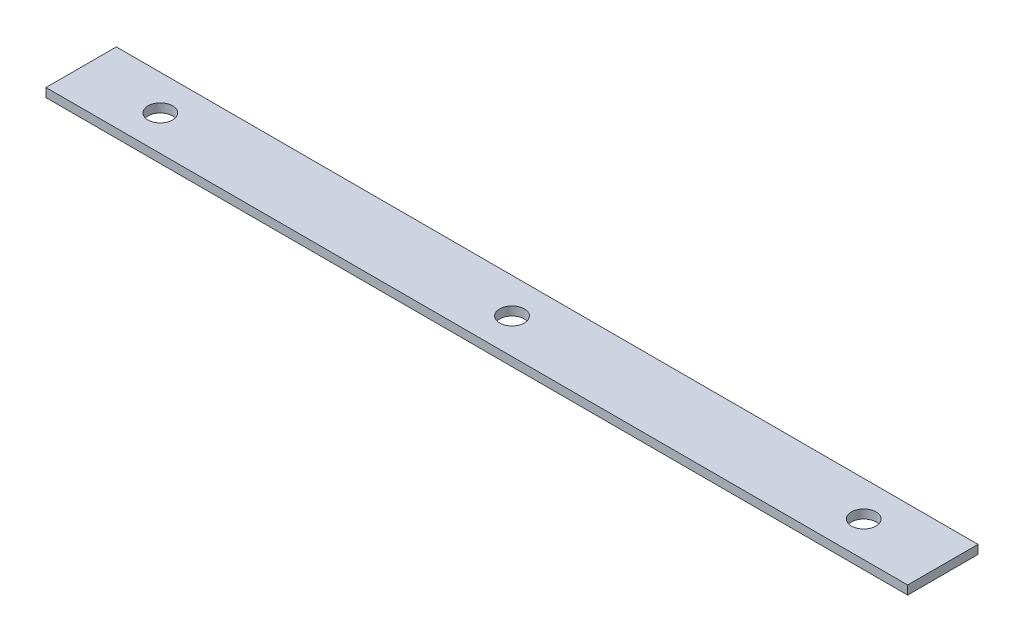
ISO-10303-21;
HEADER;
FILE_DESCRIPTION(('STEP AP214'),'2;1');
FILE_NAME('part.step','',(''),(''),'','','');
FILE_SCHEMA(('AUTOMOTIVE_DESIGN { 1 0 10303 214 1 1 1 1 }'));
ENDSEC;
DATA;
#1=APPLICATION_CONTEXT('core data for automotive mechanical design processes');
#2=APPLICATION_PROTOCOL_DEFINITION('international standard','automotive_design',2000,#1);
#3=PRODUCT_CONTEXT('',#1,'mechanical');
#4=PRODUCT('Part','Part','',(#3));
#5=PRODUCT_RELATED_PRODUCT_CATEGORY('part','',(#4));
#6=PRODUCT_DEFINITION_FORMATION('','',#4);
#7=PRODUCT_DEFINITION_CONTEXT('part definition',#1,'design');
#8=PRODUCT_DEFINITION('design','',#6,#7);
#9=PRODUCT_DEFINITION_SHAPE('','',#8);
#10=(LENGTH_UNIT() NAMED_UNIT(*) SI_UNIT(.MILLI.,.METRE.));
#11=(NAMED_UNIT(*) PLANE_ANGLE_UNIT() SI_UNIT($,.RADIAN.));
#12=(NAMED_UNIT(*) SI_UNIT($,.STERADIAN.) SOLID_ANGLE_UNIT());
#13=UNCERTAINTY_MEASURE_WITH_UNIT(LENGTH_MEASURE(1.E-05),#10,'distance_accuracy_value','');
#14=(GEOMETRIC_REPRESENTATION_CONTEXT(3) GLOBAL_UNCERTAINTY_ASSIGNED_CONTEXT((#13)) GLOBAL_UNIT_ASSIGNED_CONTEXT((#10,
#11,#12)) REPRESENTATION_CONTEXT('',''));
#15=CARTESIAN_POINT('',(0.,0.,0.));
#16=DIRECTION('',(0.,0.,1.));
#17=DIRECTION('',(1.,0.,0.));
#18=AXIS2_PLACEMENT_3D('',#15,#16,#17);
#19=CARTESIAN_POINT('',(122.500000000002,-2.50000000000045,10.0000000000027));
#20=DIRECTION('',(1.00000000000002,0.,0.));
#21=DIRECTION('',(0.,0.,-1.));
#22=AXIS2_PLACEMENT_3D('',#19,#20,#21);
#23=PLANE('',#22);
#24=DIRECTION('',(0.,0.,-1.));
#25=VECTOR('',#24,1.);
#26=CARTESIAN_POINT('',(122.500000000002,-4.44089209850063E-13,10.000000000002));
#27=LINE('',#26,#25);
#28=CARTESIAN_POINT('',(122.500000000002,-4.44089209850063E-13,10.000000000002));
#29=VERTEX_POINT('',#28);
#30=CARTESIAN_POINT('',(122.500000000002,1.11022302462516E-13,-9.99999999999823));
#31=VERTEX_POINT('',#30);
#32=EDGE_CURVE('E103',#29,#31,#27,.T.);
#33=ORIENTED_EDGE('',*,*,#32,.F.);
#34=DIRECTION('',(0.,1.00000000000002,0.));
#35=VECTOR('',#34,1.);
#36=CARTESIAN_POINT('',(122.500000000002,-2.50000000000045,10.0000000000027));
#37=LINE('',#36,#35);
#38=CARTESIAN_POINT('',(122.500000000002,-2.50000000000045,10.0000000000027));
#39=VERTEX_POINT('',#38);
#40=EDGE_CURVE('E11',#39,#29,#37,.T.);
#41=ORIENTED_EDGE('',*,*,#40,.F.);
#42=DIRECTION('',(0.,0.,-1.));
#43=VECTOR('',#42,1.);
#44=CARTESIAN_POINT('',(122.500000000002,-2.50000000000045,10.0000000000027));
#45=LINE('',#44,#43);
#46=CARTESIAN_POINT('',(122.500000000002,-2.49999999999984,-9.99999999999757));
#47=VERTEX_POINT('',#46);
#48=EDGE_CURVE('E96',#39,#47,#45,.T.);
#49=ORIENTED_EDGE('',*,*,#48,.T.);
#50=DIRECTION('',(0.,1.00000000000002,0.));
#51=VECTOR('',#50,1.);
#52=CARTESIAN_POINT('',(122.500000000002,-2.49999999999984,-9.99999999999757));
#53=LINE('',#52,#51);
#54=EDGE_CURVE('E41',#47,#31,#53,.T.);
#55=ORIENTED_EDGE('',*,*,#54,.T.);
#56=EDGE_LOOP('',(#33,#41,#49,#55));
#57=FACE_BOUND('',#56,.T.);
#58=ADVANCED_FACE('F38',(#57),#23,.T.);
#59=CARTESIAN_POINT('',(-122.500000000003,-2.50000000000006,10.0000000000001));
#60=DIRECTION('',(0.,0.,1.));
#61=DIRECTION('',(1.00000000000002,0.,0.));
#62=AXIS2_PLACEMENT_3D('',#59,#60,#61);
#63=PLANE('',#62);
#64=DIRECTION('',(1.00000000000002,0.,0.));
#65=VECTOR('',#64,1.);
#66=CARTESIAN_POINT('',(-122.500000000003,-2.22044604925031E-13,9.99999999999979));
#67=LINE('',#66,#65);
#68=CARTESIAN_POINT('',(-122.500000000003,-2.22044604925031E-13,9.99999999999979));
#69=VERTEX_POINT('',#68);
#70=EDGE_CURVE('E98',#69,#29,#67,.T.);
#71=ORIENTED_EDGE('',*,*,#70,.F.);
#72=DIRECTION('',(0.,1.00000000000002,0.));
#73=VECTOR('',#72,1.);
#74=CARTESIAN_POINT('',(-122.500000000003,-2.50000000000006,10.0000000000001));
#75=LINE('',#74,#73);
#76=CARTESIAN_POINT('',(-122.500000000003,-2.50000000000006,10.0000000000001));
#77=VERTEX_POINT('',#76);
#78=EDGE_CURVE('E47',#77,#69,#75,.T.);
#79=ORIENTED_EDGE('',*,*,#78,.F.);
#80=DIRECTION('',(1.00000000000002,0.,0.));
#81=VECTOR('',#80,1.);
#82=CARTESIAN_POINT('',(-122.500000000003,-2.50000000000006,10.0000000000001));
#83=LINE('',#82,#81);
#84=EDGE_CURVE('E93',#77,#39,#83,.T.);
#85=ORIENTED_EDGE('',*,*,#84,.T.);
#86=ORIENTED_EDGE('',*,*,#40,.T.);
#87=EDGE_LOOP('',(#71,#79,#85,#86));
#88=FACE_BOUND('',#87,.T.);
#89=ADVANCED_FACE('F114',(#88),#63,.T.);
#90=CARTESIAN_POINT('',(-122.500000000003,-2.50000000000006,10.0000000000001));
#91=DIRECTION('',(-1.00000000000002,0.,0.));
#92=DIRECTION('',(0.,0.,1.));
#93=AXIS2_PLACEMENT_3D('',#90,#91,#92);
#94=PLANE('',#93);
#95=DIRECTION('',(0.,0.,1.));
#96=VECTOR('',#95,1.);
#97=CARTESIAN_POINT('',(-122.500000000003,-2.22044604925031E-13,9.99999999999979));
#98=LINE('',#97,#96);
#99=CARTESIAN_POINT('',(-122.500000000003,0.,-10.0000000000005));
#100=VERTEX_POINT('',#99);
#101=EDGE_CURVE('E88',#100,#69,#98,.T.);
#102=ORIENTED_EDGE('',*,*,#101,.F.);
#103=DIRECTION('',(0.,1.00000000000002,0.));
#104=VECTOR('',#103,1.);
#105=CARTESIAN_POINT('',(-122.500000000003,-2.49999999999956,-10.0000000000001));
#106=LINE('',#105,#104);
#107=CARTESIAN_POINT('',(-122.500000000003,-2.49999999999956,-10.0000000000001));
#108=VERTEX_POINT('',#107);
#109=EDGE_CURVE('E83',#108,#100,#106,.T.);
#110=ORIENTED_EDGE('',*,*,#109,.F.);
#111=DIRECTION('',(0.,0.,1.));
#112=VECTOR('',#111,1.);
#113=CARTESIAN_POINT('',(-122.500000000003,-2.50000000000006,10.0000000000001));
#114=LINE('',#113,#112);
#115=EDGE_CURVE('E86',#108,#77,#114,.T.);
#116=ORIENTED_EDGE('',*,*,#115,.T.);
#117=ORIENTED_EDGE('',*,*,#78,.T.);
#118=EDGE_LOOP('',(#102,#110,#116,#117));
#119=FACE_BOUND('',#118,.T.);
#120=ADVANCED_FACE('F85',(#119),#94,.T.);
#121=CARTESIAN_POINT('',(-122.500000000003,-2.49999999999956,-10.0000000000001));
#122=DIRECTION('',(0.,0.,-1.));
#123=DIRECTION('',(-1.00000000000002,0.,0.));
#124=AXIS2_PLACEMENT_3D('',#121,#122,#123);
#125=PLANE('',#124);
#126=DIRECTION('',(-1.00000000000002,0.,0.));
#127=VECTOR('',#126,1.);
#128=CARTESIAN_POINT('',(-122.500000000003,0.,-10.0000000000005));
#129=LINE('',#128,#127);
#130=EDGE_CURVE('E106',#31,#100,#129,.T.);
#131=ORIENTED_EDGE('',*,*,#130,.F.);
#132=ORIENTED_EDGE('',*,*,#54,.F.);
#133=DIRECTION('',(-1.00000000000002,0.,0.));
#134=VECTOR('',#133,1.);
#135=CARTESIAN_POINT('',(-122.500000000003,-2.49999999999956,-10.0000000000001));
#136=LINE('',#135,#134);
#137=EDGE_CURVE('E92',#47,#108,#136,.T.);
#138=ORIENTED_EDGE('',*,*,#137,.T.);
#139=ORIENTED_EDGE('',*,*,#109,.T.);
#140=EDGE_LOOP('',(#131,#132,#138,#139));
#141=FACE_BOUND('',#140,.T.);
#142=ADVANCED_FACE('F95',(#141),#125,.T.);
#143=CARTESIAN_POINT('',(-3.19189119579733E-13,-2.50000000000017,0.));
#144=DIRECTION('',(0.,-1.00000000000002,0.));
#145=DIRECTION('',(0.,0.,-1.));
#146=AXIS2_PLACEMENT_3D('',#143,#144,#145);
#147=PLANE('',#146);
#148=CARTESIAN_POINT('',(-100.000000000002,-2.50000000000006,2.55351295663786E-12));
#149=DIRECTION('',(0.,-1.00000000000002,0.));
#150=DIRECTION('',(0.,0.,-1.));
#151=AXIS2_PLACEMENT_3D('',#148,#149,#150);
#152=CIRCLE('',#151,3.5);
#153=CARTESIAN_POINT('',(-100.000000000002,-2.50000000000006,-3.49999999999745));
#154=VERTEX_POINT('',#153);
#155=EDGE_CURVE('E151',#154,#154,#152,.T.);
#156=ORIENTED_EDGE('',*,*,#155,.F.);
#157=EDGE_LOOP('',(#156));
#158=FACE_BOUND('',#157,.T.);
#159=CARTESIAN_POINT('',(100.000000000001,-2.50000000000017,-4.44089209850063E-13));
#160=DIRECTION('',(0.,-1.00000000000002,0.));
#161=DIRECTION('',(0.,0.,-1.));
#162=AXIS2_PLACEMENT_3D('',#159,#160,#161);
#163=CIRCLE('',#162,3.5);
#164=CARTESIAN_POINT('',(100.000000000001,-2.50000000000017,-3.50000000000045));
#165=VERTEX_POINT('',#164);
#166=EDGE_CURVE('E162',#165,#165,#163,.T.);
#167=ORIENTED_EDGE('',*,*,#166,.F.);
#168=EDGE_LOOP('',(#167));
#169=FACE_BOUND('',#168,.T.);
#170=CARTESIAN_POINT('',(-3.19189119579733E-13,-2.50000000000017,0.));
#171=DIRECTION('',(0.,-1.00000000000002,0.));
#172=DIRECTION('',(0.,0.,-1.));
#173=AXIS2_PLACEMENT_3D('',#170,#171,#172);
#174=CIRCLE('',#173,3.5);
#175=CARTESIAN_POINT('',(-3.19189119579732E-13,-2.50000000000017,-3.5));
#176=VERTEX_POINT('',#175);
#177=EDGE_CURVE('E107',#176,#176,#174,.T.);
#178=ORIENTED_EDGE('',*,*,#177,.F.);
#179=EDGE_LOOP('',(#178));
#180=FACE_BOUND('',#179,.T.);
#181=ORIENTED_EDGE('',*,*,#48,.F.);
#182=ORIENTED_EDGE('',*,*,#84,.F.);
#183=ORIENTED_EDGE('',*,*,#115,.F.);
#184=ORIENTED_EDGE('',*,*,#137,.F.);
#185=EDGE_LOOP('',(#181,#182,#183,#184));
#186=FACE_BOUND('',#185,.T.);
#187=ADVANCED_FACE('F91',(#158,#169,#180,#186),#147,.T.);
#188=CARTESIAN_POINT('',(0.,0.,0.));
#189=DIRECTION('',(0.,-1.00000000000002,0.));
#190=DIRECTION('',(0.,0.,-1.));
#191=AXIS2_PLACEMENT_3D('',#188,#189,#190);
#192=PLANE('',#191);
#193=CARTESIAN_POINT('',(-100.000000000002,4.44089209850063E-13,2.88657986402541E-12));
#194=DIRECTION('',(0.,1.00000000000002,0.));
#195=DIRECTION('',(0.,0.,1.));
#196=AXIS2_PLACEMENT_3D('',#193,#194,#195);
#197=CIRCLE('',#196,3.5);
#198=CARTESIAN_POINT('',(-100.000000000002,4.44089209850063E-13,3.50000000000289));
#199=VERTEX_POINT('',#198);
#200=EDGE_CURVE('E154',#199,#199,#197,.T.);
#201=ORIENTED_EDGE('',*,*,#200,.F.);
#202=EDGE_LOOP('',(#201));
#203=FACE_BOUND('',#202,.T.);
#204=CARTESIAN_POINT('',(100.000000000002,-2.22044604925031E-13,-4.44089209850063E-13));
#205=DIRECTION('',(0.,1.00000000000002,0.));
#206=DIRECTION('',(0.,0.,1.));
#207=AXIS2_PLACEMENT_3D('',#204,#205,#206);
#208=CIRCLE('',#207,3.5);
#209=CARTESIAN_POINT('',(100.000000000002,-2.22044604925031E-13,3.49999999999956));
#210=VERTEX_POINT('',#209);
#211=EDGE_CURVE('E159',#210,#210,#208,.T.);
#212=ORIENTED_EDGE('',*,*,#211,.F.);
#213=EDGE_LOOP('',(#212));
#214=FACE_BOUND('',#213,.T.);
#215=CARTESIAN_POINT('',(0.,0.,0.));
#216=DIRECTION('',(0.,1.00000000000002,0.));
#217=DIRECTION('',(0.,0.,1.));
#218=AXIS2_PLACEMENT_3D('',#215,#216,#217);
#219=CIRCLE('',#218,3.5);
#220=CARTESIAN_POINT('',(0.,0.,3.5));
#221=VERTEX_POINT('',#220);
#222=EDGE_CURVE('E155',#221,#221,#219,.T.);
#223=ORIENTED_EDGE('',*,*,#222,.F.);
#224=EDGE_LOOP('',(#223));
#225=FACE_BOUND('',#224,.T.);
#226=ORIENTED_EDGE('',*,*,#32,.T.);
#227=ORIENTED_EDGE('',*,*,#130,.T.);
#228=ORIENTED_EDGE('',*,*,#101,.T.);
#229=ORIENTED_EDGE('',*,*,#70,.T.);
#230=EDGE_LOOP('',(#226,#227,#228,#229));
#231=FACE_BOUND('',#230,.T.);
#232=ADVANCED_FACE('F113',(#203,#214,#225,#231),#192,.F.);
#233=CARTESIAN_POINT('',(-1.94289029309402E-13,-9.99999999999993,1.11022302462516E-12));
#234=DIRECTION('',(0.,1.00000000000002,0.));
#235=DIRECTION('',(0.,0.,1.));
#236=AXIS2_PLACEMENT_3D('',#233,#234,#235);
#237=CYLINDRICAL_SURFACE('',#236,3.5);
#238=ORIENTED_EDGE('',*,*,#177,.T.);
#239=EDGE_LOOP('',(#238));
#240=FACE_BOUND('',#239,.T.);
#241=ORIENTED_EDGE('',*,*,#222,.T.);
#242=EDGE_LOOP('',(#241));
#243=FACE_BOUND('',#242,.T.);
#244=ADVANCED_FACE('F132',(#240,#243),#237,.F.);
#245=CARTESIAN_POINT('',(100.000000000001,-10.0000000000006,1.11022302462516E-12));
#246=DIRECTION('',(0.,1.00000000000002,0.));
#247=DIRECTION('',(0.,0.,1.));
#248=AXIS2_PLACEMENT_3D('',#245,#246,#247);
#249=CYLINDRICAL_SURFACE('',#248,3.5);
#250=ORIENTED_EDGE('',*,*,#166,.T.);
#251=EDGE_LOOP('',(#250));
#252=FACE_BOUND('',#251,.T.);
#253=ORIENTED_EDGE('',*,*,#211,.T.);
#254=EDGE_LOOP('',(#253));
#255=FACE_BOUND('',#254,.T.);
#256=ADVANCED_FACE('F139',(#252,#255),#249,.F.);
#257=CARTESIAN_POINT('',(-100.000000000003,-9.99999999999968,2.99760216648792E-12));
#258=DIRECTION('',(0.,1.00000000000002,0.));
#259=DIRECTION('',(0.,0.,1.));
#260=AXIS2_PLACEMENT_3D('',#257,#258,#259);
#261=CYLINDRICAL_SURFACE('',#260,3.5);
#262=ORIENTED_EDGE('',*,*,#155,.T.);
#263=EDGE_LOOP('',(#262));
#264=FACE_BOUND('',#263,.T.);
#265=ORIENTED_EDGE('',*,*,#200,.T.);
#266=EDGE_LOOP('',(#265));
#267=FACE_BOUND('',#266,.T.);
#268=ADVANCED_FACE('F143',(#264,#267),#261,.F.);
#269=CLOSED_SHELL('',(#58,#89,#120,#142,#187,#232,#244,#256,#268));
#270=MANIFOLD_SOLID_BREP('B2',#269);
#271=ADVANCED_BREP_SHAPE_REPRESENTATION('',(#18,#270),#14);
#272=SHAPE_DEFINITION_REPRESENTATION(#9,#271);
ENDSEC;
END-ISO-10303-21;
